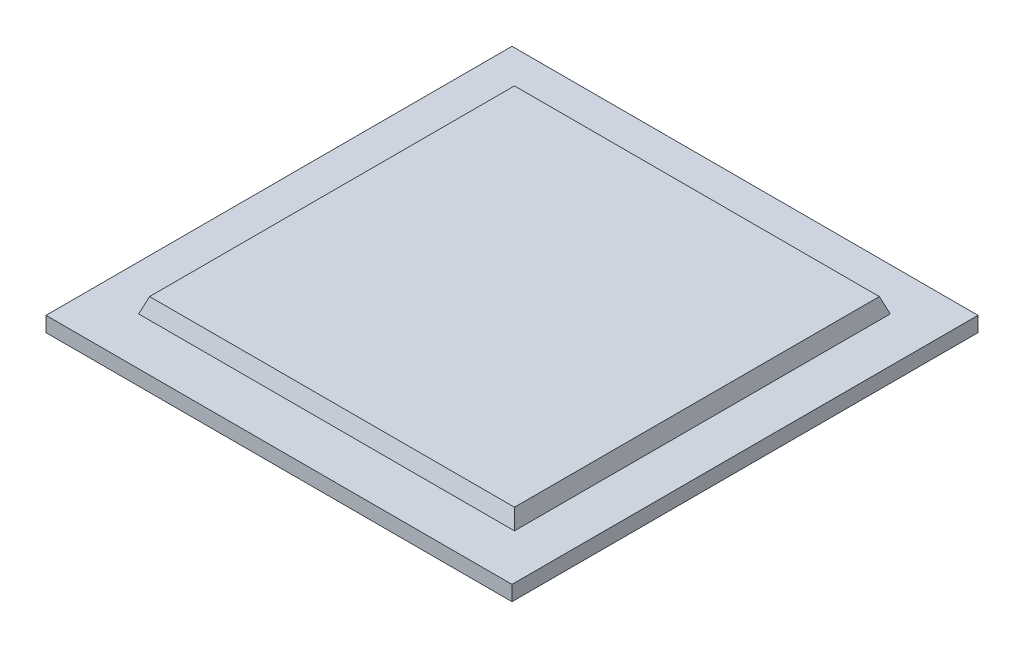
ISO-10303-21;
HEADER;
FILE_DESCRIPTION(('STEP AP214'),'2;1');
FILE_NAME('part.step','',(''),(''),'','','');
FILE_SCHEMA(('AUTOMOTIVE_DESIGN { 1 0 10303 214 1 1 1 1 }'));
ENDSEC;
DATA;
#1=APPLICATION_CONTEXT('core data for automotive mechanical design processes');
#2=APPLICATION_PROTOCOL_DEFINITION('international standard','automotive_design',2000,#1);
#3=PRODUCT_CONTEXT('',#1,'mechanical');
#4=PRODUCT('Part','Part','',(#3));
#5=PRODUCT_RELATED_PRODUCT_CATEGORY('part','',(#4));
#6=PRODUCT_DEFINITION_FORMATION('','',#4);
#7=PRODUCT_DEFINITION_CONTEXT('part definition',#1,'design');
#8=PRODUCT_DEFINITION('design','',#6,#7);
#9=PRODUCT_DEFINITION_SHAPE('','',#8);
#10=(LENGTH_UNIT() NAMED_UNIT(*) SI_UNIT(.MILLI.,.METRE.));
#11=(NAMED_UNIT(*) PLANE_ANGLE_UNIT() SI_UNIT($,.RADIAN.));
#12=(NAMED_UNIT(*) SI_UNIT($,.STERADIAN.) SOLID_ANGLE_UNIT());
#13=UNCERTAINTY_MEASURE_WITH_UNIT(LENGTH_MEASURE(1.E-05),#10,'distance_accuracy_value','');
#14=(GEOMETRIC_REPRESENTATION_CONTEXT(3) GLOBAL_UNCERTAINTY_ASSIGNED_CONTEXT((#13)) GLOBAL_UNIT_ASSIGNED_CONTEXT((#10,
#11,#12)) REPRESENTATION_CONTEXT('',''));
#15=CARTESIAN_POINT('',(0.,0.,0.));
#16=DIRECTION('',(0.,0.,1.));
#17=DIRECTION('',(1.,0.,0.));
#18=AXIS2_PLACEMENT_3D('',#15,#16,#17);
#19=CARTESIAN_POINT('',(-15.5,1.,15.5));
#20=DIRECTION('',(0.,1.,0.));
#21=DIRECTION('',(0.,0.,1.));
#22=AXIS2_PLACEMENT_3D('',#19,#20,#21);
#23=PLANE('',#22);
#24=DIRECTION('',(0.,0.,1.));
#25=VECTOR('',#24,1.);
#26=CARTESIAN_POINT('',(-15.5,1.,-15.5));
#27=LINE('',#26,#25);
#28=CARTESIAN_POINT('',(-15.5,1.,-15.5));
#29=VERTEX_POINT('',#28);
#30=CARTESIAN_POINT('',(-15.5,1.,15.5));
#31=VERTEX_POINT('',#30);
#32=EDGE_CURVE('E147',#29,#31,#27,.T.);
#33=ORIENTED_EDGE('',*,*,#32,.T.);
#34=DIRECTION('',(1.,0.,0.));
#35=VECTOR('',#34,1.);
#36=CARTESIAN_POINT('',(-15.5,1.,15.5));
#37=LINE('',#36,#35);
#38=CARTESIAN_POINT('',(15.5,1.,15.5));
#39=VERTEX_POINT('',#38);
#40=EDGE_CURVE('E85',#31,#39,#37,.T.);
#41=ORIENTED_EDGE('',*,*,#40,.T.);
#42=DIRECTION('',(0.,0.,-1.));
#43=VECTOR('',#42,1.);
#44=CARTESIAN_POINT('',(15.5,1.,-15.5));
#45=LINE('',#44,#43);
#46=CARTESIAN_POINT('',(15.5,1.,-15.5));
#47=VERTEX_POINT('',#46);
#48=EDGE_CURVE('E150',#39,#47,#45,.T.);
#49=ORIENTED_EDGE('',*,*,#48,.T.);
#50=DIRECTION('',(-1.,0.,0.));
#51=VECTOR('',#50,1.);
#52=CARTESIAN_POINT('',(-15.5,1.,-15.5));
#53=LINE('',#52,#51);
#54=EDGE_CURVE('E57',#47,#29,#53,.T.);
#55=ORIENTED_EDGE('',*,*,#54,.T.);
#56=EDGE_LOOP('',(#33,#41,#49,#55));
#57=FACE_BOUND('',#56,.T.);
#58=DIRECTION('',(1.,0.,0.));
#59=VECTOR('',#58,1.);
#60=CARTESIAN_POINT('',(-12.5000000000002,1.,12.3369909578855));
#61=LINE('',#60,#59);
#62=CARTESIAN_POINT('',(-12.5000000000002,1.,12.3369909578855));
#63=VERTEX_POINT('',#62);
#64=CARTESIAN_POINT('',(12.4999999999997,1.,12.3369909578855));
#65=VERTEX_POINT('',#64);
#66=EDGE_CURVE('E112',#63,#65,#61,.T.);
#67=ORIENTED_EDGE('',*,*,#66,.F.);
#68=DIRECTION('',(0.,0.,1.));
#69=VECTOR('',#68,1.);
#70=CARTESIAN_POINT('',(-12.5000000000002,1.,-12.6630090421145));
#71=LINE('',#70,#69);
#72=CARTESIAN_POINT('',(-12.5000000000002,1.,-12.6630090421145));
#73=VERTEX_POINT('',#72);
#74=EDGE_CURVE('E123',#73,#63,#71,.T.);
#75=ORIENTED_EDGE('',*,*,#74,.F.);
#76=DIRECTION('',(-1.,0.,0.));
#77=VECTOR('',#76,1.);
#78=CARTESIAN_POINT('',(-12.5000000000002,1.,-12.6630090421145));
#79=LINE('',#78,#77);
#80=CARTESIAN_POINT('',(12.4999999999997,1.,-12.6630090421145));
#81=VERTEX_POINT('',#80);
#82=EDGE_CURVE('E133',#81,#73,#79,.T.);
#83=ORIENTED_EDGE('',*,*,#82,.F.);
#84=DIRECTION('',(0.,0.,-1.));
#85=VECTOR('',#84,1.);
#86=CARTESIAN_POINT('',(12.4999999999997,1.,-12.6630090421145));
#87=LINE('',#86,#85);
#88=EDGE_CURVE('E131',#65,#81,#87,.T.);
#89=ORIENTED_EDGE('',*,*,#88,.F.);
#90=EDGE_LOOP('',(#67,#75,#83,#89));
#91=FACE_BOUND('',#90,.T.);
#92=ADVANCED_FACE('F33',(#57,#91),#23,.T.);
#93=CARTESIAN_POINT('',(-15.5,1.,-15.5));
#94=DIRECTION('',(1.,0.,0.));
#95=DIRECTION('',(0.,0.,-1.));
#96=AXIS2_PLACEMENT_3D('',#93,#94,#95);
#97=PLANE('',#96);
#98=DIRECTION('',(0.,0.,1.));
#99=VECTOR('',#98,1.);
#100=CARTESIAN_POINT('',(-15.5,0.,-15.5));
#101=LINE('',#100,#99);
#102=CARTESIAN_POINT('',(-15.5,0.,-15.5));
#103=VERTEX_POINT('',#102);
#104=CARTESIAN_POINT('',(-15.5,0.,15.5));
#105=VERTEX_POINT('',#104);
#106=EDGE_CURVE('E118',#103,#105,#101,.T.);
#107=ORIENTED_EDGE('',*,*,#106,.T.);
#108=DIRECTION('',(0.,-1.,0.));
#109=VECTOR('',#108,1.);
#110=CARTESIAN_POINT('',(-15.5,1.,15.5));
#111=LINE('',#110,#109);
#112=EDGE_CURVE('E11',#31,#105,#111,.T.);
#113=ORIENTED_EDGE('',*,*,#112,.F.);
#114=ORIENTED_EDGE('',*,*,#32,.F.);
#115=DIRECTION('',(0.,-1.,0.));
#116=VECTOR('',#115,1.);
#117=CARTESIAN_POINT('',(-15.5,1.,-15.5));
#118=LINE('',#117,#116);
#119=EDGE_CURVE('E153',#29,#103,#118,.T.);
#120=ORIENTED_EDGE('',*,*,#119,.T.);
#121=EDGE_LOOP('',(#107,#113,#114,#120));
#122=FACE_BOUND('',#121,.T.);
#123=ADVANCED_FACE('F35',(#122),#97,.F.);
#124=CARTESIAN_POINT('',(-15.5,1.,15.5));
#125=DIRECTION('',(0.,0.,-1.));
#126=DIRECTION('',(-1.,0.,0.));
#127=AXIS2_PLACEMENT_3D('',#124,#125,#126);
#128=PLANE('',#127);
#129=DIRECTION('',(1.,0.,0.));
#130=VECTOR('',#129,1.);
#131=CARTESIAN_POINT('',(-15.5,0.,15.5));
#132=LINE('',#131,#130);
#133=CARTESIAN_POINT('',(15.5,0.,15.5));
#134=VERTEX_POINT('',#133);
#135=EDGE_CURVE('E156',#105,#134,#132,.T.);
#136=ORIENTED_EDGE('',*,*,#135,.T.);
#137=DIRECTION('',(0.,-1.,0.));
#138=VECTOR('',#137,1.);
#139=CARTESIAN_POINT('',(15.5,1.,15.5));
#140=LINE('',#139,#138);
#141=EDGE_CURVE('E41',#39,#134,#140,.T.);
#142=ORIENTED_EDGE('',*,*,#141,.F.);
#143=ORIENTED_EDGE('',*,*,#40,.F.);
#144=ORIENTED_EDGE('',*,*,#112,.T.);
#145=EDGE_LOOP('',(#136,#142,#143,#144));
#146=FACE_BOUND('',#145,.T.);
#147=ADVANCED_FACE('F183',(#146),#128,.F.);
#148=CARTESIAN_POINT('',(15.5,1.,-15.5));
#149=DIRECTION('',(-1.,0.,0.));
#150=DIRECTION('',(0.,0.,1.));
#151=AXIS2_PLACEMENT_3D('',#148,#149,#150);
#152=PLANE('',#151);
#153=DIRECTION('',(0.,0.,-1.));
#154=VECTOR('',#153,1.);
#155=CARTESIAN_POINT('',(15.5,0.,-15.5));
#156=LINE('',#155,#154);
#157=CARTESIAN_POINT('',(15.5,0.,-15.5));
#158=VERTEX_POINT('',#157);
#159=EDGE_CURVE('E158',#134,#158,#156,.T.);
#160=ORIENTED_EDGE('',*,*,#159,.T.);
#161=DIRECTION('',(0.,-1.,0.));
#162=VECTOR('',#161,1.);
#163=CARTESIAN_POINT('',(15.5,1.,-15.5));
#164=LINE('',#163,#162);
#165=EDGE_CURVE('E162',#47,#158,#164,.T.);
#166=ORIENTED_EDGE('',*,*,#165,.F.);
#167=ORIENTED_EDGE('',*,*,#48,.F.);
#168=ORIENTED_EDGE('',*,*,#141,.T.);
#169=EDGE_LOOP('',(#160,#166,#167,#168));
#170=FACE_BOUND('',#169,.T.);
#171=ADVANCED_FACE('F167',(#170),#152,.F.);
#172=CARTESIAN_POINT('',(-15.5,1.,-15.5));
#173=DIRECTION('',(0.,0.,1.));
#174=DIRECTION('',(1.,0.,0.));
#175=AXIS2_PLACEMENT_3D('',#172,#173,#174);
#176=PLANE('',#175);
#177=DIRECTION('',(-1.,0.,0.));
#178=VECTOR('',#177,1.);
#179=CARTESIAN_POINT('',(-15.5,0.,-15.5));
#180=LINE('',#179,#178);
#181=EDGE_CURVE('E78',#158,#103,#180,.T.);
#182=ORIENTED_EDGE('',*,*,#181,.T.);
#183=ORIENTED_EDGE('',*,*,#119,.F.);
#184=ORIENTED_EDGE('',*,*,#54,.F.);
#185=ORIENTED_EDGE('',*,*,#165,.T.);
#186=EDGE_LOOP('',(#182,#183,#184,#185));
#187=FACE_BOUND('',#186,.T.);
#188=ADVANCED_FACE('F175',(#187),#176,.F.);
#189=CARTESIAN_POINT('',(-15.5,0.,15.5));
#190=DIRECTION('',(0.,1.,0.));
#191=DIRECTION('',(0.,0.,1.));
#192=AXIS2_PLACEMENT_3D('',#189,#190,#191);
#193=PLANE('',#192);
#194=ORIENTED_EDGE('',*,*,#106,.F.);
#195=ORIENTED_EDGE('',*,*,#181,.F.);
#196=ORIENTED_EDGE('',*,*,#159,.F.);
#197=ORIENTED_EDGE('',*,*,#135,.F.);
#198=EDGE_LOOP('',(#194,#195,#196,#197));
#199=FACE_BOUND('',#198,.T.);
#200=ADVANCED_FACE('F171',(#199),#193,.F.);
#201=CARTESIAN_POINT('',(-12.5000000000002,1.,-12.6630090421145));
#202=DIRECTION('',(-0.939692620785908,0.342020143325669,0.));
#203=DIRECTION('',(-0.342020143325669,-0.939692620785909,0.));
#204=AXIS2_PLACEMENT_3D('',#201,#202,#203);
#205=PLANE('',#204);
#206=ORIENTED_EDGE('',*,*,#74,.T.);
#207=DIRECTION('',(-0.323615577118185,-0.889126490715988,0.323615577118185));
#208=VECTOR('',#207,1.);
#209=CARTESIAN_POINT('',(-12.5000000000002,1.,12.3369909578855));
#210=LINE('',#209,#208);
#211=CARTESIAN_POINT('',(-12.136029765734,2.,11.9730207236193));
#212=VERTEX_POINT('',#211);
#213=EDGE_CURVE('E107',#212,#63,#210,.T.);
#214=ORIENTED_EDGE('',*,*,#213,.F.);
#215=DIRECTION('',(0.,0.,-1.));
#216=VECTOR('',#215,1.);
#217=CARTESIAN_POINT('',(-12.136029765734,2.,-12.6630090421145));
#218=LINE('',#217,#216);
#219=CARTESIAN_POINT('',(-12.136029765734,2.,-12.2990388078483));
#220=VERTEX_POINT('',#219);
#221=EDGE_CURVE('E136',#220,#212,#218,.F.);
#222=ORIENTED_EDGE('',*,*,#221,.F.);
#223=DIRECTION('',(-0.323615577118185,-0.889126490715988,-0.323615577118185));
#224=VECTOR('',#223,1.);
#225=CARTESIAN_POINT('',(-12.5000000000002,1.,-12.6630090421145));
#226=LINE('',#225,#224);
#227=EDGE_CURVE('E126',#220,#73,#226,.T.);
#228=ORIENTED_EDGE('',*,*,#227,.T.);
#229=EDGE_LOOP('',(#206,#214,#222,#228));
#230=FACE_BOUND('',#229,.T.);
#231=ADVANCED_FACE('F124',(#230),#205,.T.);
#232=CARTESIAN_POINT('',(-12.5000000000002,1.,12.3369909578855));
#233=DIRECTION('',(0.,0.342020143325669,0.939692620785908));
#234=DIRECTION('',(0.,-0.939692620785908,0.342020143325669));
#235=AXIS2_PLACEMENT_3D('',#232,#233,#234);
#236=PLANE('',#235);
#237=ORIENTED_EDGE('',*,*,#66,.T.);
#238=DIRECTION('',(0.323615577118185,-0.889126490715988,0.323615577118185));
#239=VECTOR('',#238,1.);
#240=CARTESIAN_POINT('',(9.88182395616126,8.19337956060302,9.71881491404712));
#241=LINE('',#240,#239);
#242=CARTESIAN_POINT('',(12.1360297657334,2.,11.9730207236193));
#243=VERTEX_POINT('',#242);
#244=EDGE_CURVE('E119',#243,#65,#241,.T.);
#245=ORIENTED_EDGE('',*,*,#244,.F.);
#246=DIRECTION('',(-1.,0.,0.));
#247=VECTOR('',#246,1.);
#248=CARTESIAN_POINT('',(-12.5000000000002,2.,11.9730207236193));
#249=LINE('',#248,#247);
#250=EDGE_CURVE('E114',#212,#243,#249,.F.);
#251=ORIENTED_EDGE('',*,*,#250,.F.);
#252=ORIENTED_EDGE('',*,*,#213,.T.);
#253=EDGE_LOOP('',(#237,#245,#251,#252));
#254=FACE_BOUND('',#253,.T.);
#255=ADVANCED_FACE('F109',(#254),#236,.T.);
#256=CARTESIAN_POINT('',(12.4999999999997,1.,-12.6630090421145));
#257=DIRECTION('',(0.939692620785908,0.342020143325669,0.));
#258=DIRECTION('',(-0.342020143325669,0.939692620785909,0.));
#259=AXIS2_PLACEMENT_3D('',#256,#257,#258);
#260=PLANE('',#259);
#261=ORIENTED_EDGE('',*,*,#88,.T.);
#262=DIRECTION('',(0.323615577118185,-0.889126490715988,-0.323615577118185));
#263=VECTOR('',#262,1.);
#264=CARTESIAN_POINT('',(9.88182395616128,8.19337956060297,-10.0448329982761));
#265=LINE('',#264,#263);
#266=CARTESIAN_POINT('',(12.1360297657334,2.,-12.2990388078483));
#267=VERTEX_POINT('',#266);
#268=EDGE_CURVE('E48',#267,#81,#265,.T.);
#269=ORIENTED_EDGE('',*,*,#268,.F.);
#270=DIRECTION('',(0.,0.,1.));
#271=VECTOR('',#270,1.);
#272=CARTESIAN_POINT('',(12.1360297657334,2.,-12.6630090421145));
#273=LINE('',#272,#271);
#274=EDGE_CURVE('E144',#243,#267,#273,.F.);
#275=ORIENTED_EDGE('',*,*,#274,.F.);
#276=ORIENTED_EDGE('',*,*,#244,.T.);
#277=EDGE_LOOP('',(#261,#269,#275,#276));
#278=FACE_BOUND('',#277,.T.);
#279=ADVANCED_FACE('F193',(#278),#260,.T.);
#280=CARTESIAN_POINT('',(-12.5000000000002,1.,-12.6630090421145));
#281=DIRECTION('',(0.,0.342020143325669,-0.939692620785908));
#282=DIRECTION('',(0.,0.939692620785908,0.342020143325669));
#283=AXIS2_PLACEMENT_3D('',#280,#281,#282);
#284=PLANE('',#283);
#285=ORIENTED_EDGE('',*,*,#82,.T.);
#286=ORIENTED_EDGE('',*,*,#227,.F.);
#287=DIRECTION('',(1.,0.,0.));
#288=VECTOR('',#287,1.);
#289=CARTESIAN_POINT('',(-12.5000000000002,2.,-12.2990388078483));
#290=LINE('',#289,#288);
#291=EDGE_CURVE('E139',#267,#220,#290,.F.);
#292=ORIENTED_EDGE('',*,*,#291,.F.);
#293=ORIENTED_EDGE('',*,*,#268,.T.);
#294=EDGE_LOOP('',(#285,#286,#292,#293));
#295=FACE_BOUND('',#294,.T.);
#296=ADVANCED_FACE('F196',(#295),#284,.T.);
#297=CARTESIAN_POINT('',(-12.5000000000002,2.,12.3369909578855));
#298=DIRECTION('',(0.,1.,0.));
#299=DIRECTION('',(0.,0.,1.));
#300=AXIS2_PLACEMENT_3D('',#297,#298,#299);
#301=PLANE('',#300);
#302=ORIENTED_EDGE('',*,*,#221,.T.);
#303=ORIENTED_EDGE('',*,*,#250,.T.);
#304=ORIENTED_EDGE('',*,*,#274,.T.);
#305=ORIENTED_EDGE('',*,*,#291,.T.);
#306=EDGE_LOOP('',(#302,#303,#304,#305));
#307=FACE_BOUND('',#306,.T.);
#308=ADVANCED_FACE('F200',(#307),#301,.T.);
#309=CLOSED_SHELL('',(#92,#123,#147,#171,#188,#200,#231,#255,#279,#296,#308));
#310=MANIFOLD_SOLID_BREP('B2',#309);
#311=ADVANCED_BREP_SHAPE_REPRESENTATION('',(#18,#310),#14);
#312=SHAPE_DEFINITION_REPRESENTATION(#9,#311);
ENDSEC;
END-ISO-10303-21;
